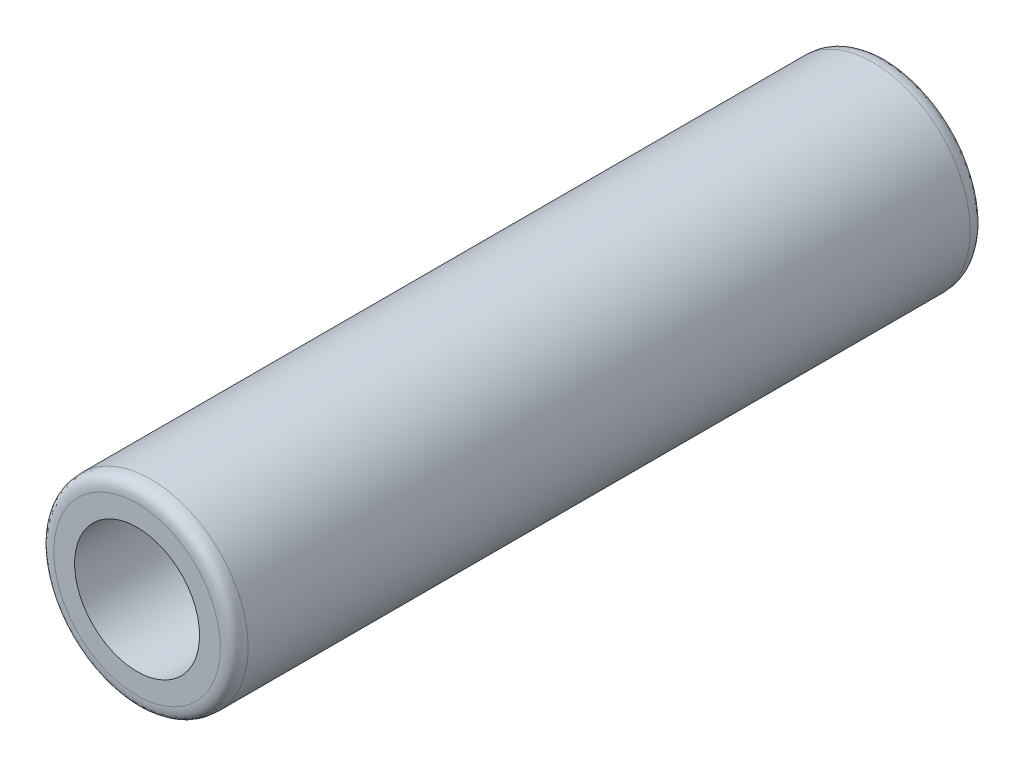
ISO-10303-21;
HEADER;
FILE_DESCRIPTION(('STEP AP214'),'2;1');
FILE_NAME('part.step','',(''),(''),'','','');
FILE_SCHEMA(('AUTOMOTIVE_DESIGN { 1 0 10303 214 1 1 1 1 }'));
ENDSEC;
DATA;
#1=APPLICATION_CONTEXT('core data for automotive mechanical design processes');
#2=APPLICATION_PROTOCOL_DEFINITION('international standard','automotive_design',2000,#1);
#3=PRODUCT_CONTEXT('',#1,'mechanical');
#4=PRODUCT('Part','Part','',(#3));
#5=PRODUCT_RELATED_PRODUCT_CATEGORY('part','',(#4));
#6=PRODUCT_DEFINITION_FORMATION('','',#4);
#7=PRODUCT_DEFINITION_CONTEXT('part definition',#1,'design');
#8=PRODUCT_DEFINITION('design','',#6,#7);
#9=PRODUCT_DEFINITION_SHAPE('','',#8);
#10=(LENGTH_UNIT() NAMED_UNIT(*) SI_UNIT(.MILLI.,.METRE.));
#11=(NAMED_UNIT(*) PLANE_ANGLE_UNIT() SI_UNIT($,.RADIAN.));
#12=(NAMED_UNIT(*) SI_UNIT($,.STERADIAN.) SOLID_ANGLE_UNIT());
#13=UNCERTAINTY_MEASURE_WITH_UNIT(LENGTH_MEASURE(1.E-05),#10,'distance_accuracy_value','');
#14=(GEOMETRIC_REPRESENTATION_CONTEXT(3) GLOBAL_UNCERTAINTY_ASSIGNED_CONTEXT((#13)) GLOBAL_UNIT_ASSIGNED_CONTEXT((#10,
#11,#12)) REPRESENTATION_CONTEXT('',''));
#15=CARTESIAN_POINT('',(0.,0.,0.));
#16=DIRECTION('',(0.,0.,1.));
#17=DIRECTION('',(1.,0.,0.));
#18=AXIS2_PLACEMENT_3D('',#15,#16,#17);
#19=CARTESIAN_POINT('',(0.,0.,13.5));
#20=DIRECTION('',(0.,0.,1.));
#21=DIRECTION('',(1.,0.,0.));
#22=AXIS2_PLACEMENT_3D('',#19,#20,#21);
#23=PLANE('',#22);
#24=CARTESIAN_POINT('',(3.,0.,13.5));
#25=CARTESIAN_POINT('',(3.,-0.783611624891226,13.5));
#26=CARTESIAN_POINT('',(2.35083487467366,-2.35083487467368,13.5));
#27=CARTESIAN_POINT('',(0.,-3.32458256266316,13.5));
#28=CARTESIAN_POINT('',(-2.35083487467368,-2.35083487467368,13.5));
#29=CARTESIAN_POINT('',(-3.32458256266316,0.,13.5));
#30=CARTESIAN_POINT('',(-2.35083487467368,2.35083487467367,13.5));
#31=CARTESIAN_POINT('',(0.,3.32458256266316,13.5));
#32=CARTESIAN_POINT('',(2.35083487467367,2.35083487467367,13.5));
#33=CARTESIAN_POINT('',(3.,0.783611624891226,13.5));
#34=CARTESIAN_POINT('',(3.,0.,13.5));
#35=B_SPLINE_CURVE_WITH_KNOTS('',3,(#24,#25,#26,#27,#28,#29,#30,#31,#32,#33,#34),.UNSPECIFIED.,
.T.,.F.,(4,1,1,1,1,1,1,1,4),(0.,0.785398163397448,1.5707963267949,2.35619449019235,
3.14159265358979,3.92699081698724,4.71238898038469,5.49778714378214,6.28318530717959),.UNSPECIFIED.);
#36=CARTESIAN_POINT('',(3.,0.,13.5));
#37=VERTEX_POINT('',#36);
#38=EDGE_CURVE('E10',#37,#37,#35,.F.);
#39=ORIENTED_EDGE('',*,*,#38,.T.);
#40=EDGE_LOOP('',(#39));
#41=FACE_BOUND('',#40,.T.);
#42=CARTESIAN_POINT('',(0.,0.,13.5));
#43=DIRECTION('',(0.,0.,1.));
#44=DIRECTION('',(1.,0.,0.));
#45=AXIS2_PLACEMENT_3D('',#42,#43,#44);
#46=CIRCLE('',#45,2.25);
#47=CARTESIAN_POINT('',(2.25,0.,13.5));
#48=VERTEX_POINT('',#47);
#49=EDGE_CURVE('E71',#48,#48,#46,.T.);
#50=ORIENTED_EDGE('',*,*,#49,.F.);
#51=EDGE_LOOP('',(#50));
#52=FACE_BOUND('',#51,.T.);
#53=ADVANCED_FACE('F39',(#41,#52),#23,.T.);
#54=CARTESIAN_POINT('',(0.,0.,-13.5));
#55=DIRECTION('',(0.,0.,1.));
#56=DIRECTION('',(1.,0.,0.));
#57=AXIS2_PLACEMENT_3D('',#54,#55,#56);
#58=PLANE('',#57);
#59=CARTESIAN_POINT('',(3.,0.,-13.5));
#60=CARTESIAN_POINT('',(3.,0.783611624891226,-13.5));
#61=CARTESIAN_POINT('',(2.35083487467367,2.35083487467367,-13.5));
#62=CARTESIAN_POINT('',(0.,3.32458256266316,-13.5));
#63=CARTESIAN_POINT('',(-2.35083487467368,2.35083487467367,-13.5));
#64=CARTESIAN_POINT('',(-3.32458256266316,0.,-13.5));
#65=CARTESIAN_POINT('',(-2.35083487467368,-2.35083487467368,-13.5));
#66=CARTESIAN_POINT('',(0.,-3.32458256266316,-13.5));
#67=CARTESIAN_POINT('',(2.35083487467366,-2.35083487467368,-13.5));
#68=CARTESIAN_POINT('',(3.,-0.783611624891226,-13.5));
#69=CARTESIAN_POINT('',(3.,0.,-13.5));
#70=B_SPLINE_CURVE_WITH_KNOTS('',3,(#59,#60,#61,#62,#63,#64,#65,#66,#67,#68,#69),.UNSPECIFIED.,
.T.,.F.,(4,1,1,1,1,1,1,1,4),(0.,0.785398163397448,1.5707963267949,2.35619449019234,
3.14159265358979,3.92699081698724,4.71238898038469,5.49778714378214,6.28318530717959),.UNSPECIFIED.);
#71=CARTESIAN_POINT('',(3.,0.,-13.5));
#72=VERTEX_POINT('',#71);
#73=EDGE_CURVE('E53',#72,#72,#70,.F.);
#74=ORIENTED_EDGE('',*,*,#73,.T.);
#75=EDGE_LOOP('',(#74));
#76=FACE_BOUND('',#75,.T.);
#77=CARTESIAN_POINT('',(0.,0.,-13.5));
#78=DIRECTION('',(0.,0.,1.));
#79=DIRECTION('',(1.,0.,0.));
#80=AXIS2_PLACEMENT_3D('',#77,#78,#79);
#81=CIRCLE('',#80,2.25);
#82=CARTESIAN_POINT('',(2.25,0.,-13.5));
#83=VERTEX_POINT('',#82);
#84=EDGE_CURVE('E77',#83,#83,#81,.T.);
#85=ORIENTED_EDGE('',*,*,#84,.T.);
#86=EDGE_LOOP('',(#85));
#87=FACE_BOUND('',#86,.T.);
#88=ADVANCED_FACE('F99',(#76,#87),#58,.F.);
#89=CARTESIAN_POINT('',(0.,0.,13.5));
#90=DIRECTION('',(0.,0.,-1.));
#91=DIRECTION('',(-1.,0.,0.));
#92=AXIS2_PLACEMENT_3D('',#89,#90,#91);
#93=CYLINDRICAL_SURFACE('',#92,3.5);
#94=CARTESIAN_POINT('',(3.5,0.,-13.));
#95=CARTESIAN_POINT('',(3.5,-0.914213562373097,-13.));
#96=CARTESIAN_POINT('',(2.74264068711927,-2.7426406871193,-13.));
#97=CARTESIAN_POINT('',(0.,-3.87867965644035,-13.));
#98=CARTESIAN_POINT('',(-2.74264068711929,-2.74264068711929,-13.));
#99=CARTESIAN_POINT('',(-3.87867965644036,0.,-13.));
#100=CARTESIAN_POINT('',(-2.74264068711929,2.74264068711928,-13.));
#101=CARTESIAN_POINT('',(0.,3.87867965644036,-13.));
#102=CARTESIAN_POINT('',(2.74264068711928,2.74264068711928,-13.));
#103=CARTESIAN_POINT('',(3.5,0.914213562373097,-13.));
#104=CARTESIAN_POINT('',(3.5,0.,-13.));
#105=B_SPLINE_CURVE_WITH_KNOTS('',3,(#94,#95,#96,#97,#98,#99,#100,#101,#102,#103,#104),
.UNSPECIFIED.,.T.,.F.,(4,1,1,1,1,1,1,1,4),(0.,0.785398163397448,1.5707963267949,
2.35619449019235,3.14159265358979,3.92699081698724,4.71238898038469,5.49778714378214,
6.28318530717959),.UNSPECIFIED.);
#106=CARTESIAN_POINT('',(3.5,0.,-13.));
#107=VERTEX_POINT('',#106);
#108=EDGE_CURVE('E59',#107,#107,#105,.F.);
#109=ORIENTED_EDGE('',*,*,#108,.T.);
#110=EDGE_LOOP('',(#109));
#111=FACE_BOUND('',#110,.T.);
#112=CARTESIAN_POINT('',(3.5,0.,13.));
#113=CARTESIAN_POINT('',(3.5,0.914213562373097,13.));
#114=CARTESIAN_POINT('',(2.74264068711928,2.74264068711928,13.));
#115=CARTESIAN_POINT('',(0.,3.87867965644036,13.));
#116=CARTESIAN_POINT('',(-2.74264068711929,2.74264068711928,13.));
#117=CARTESIAN_POINT('',(-3.87867965644036,0.,13.));
#118=CARTESIAN_POINT('',(-2.74264068711929,-2.74264068711929,13.));
#119=CARTESIAN_POINT('',(0.,-3.87867965644035,13.));
#120=CARTESIAN_POINT('',(2.74264068711927,-2.7426406871193,13.));
#121=CARTESIAN_POINT('',(3.5,-0.914213562373097,13.));
#122=CARTESIAN_POINT('',(3.5,0.,13.));
#123=B_SPLINE_CURVE_WITH_KNOTS('',3,(#112,#113,#114,#115,#116,#117,#118,#119,#120,#121,#122),
.UNSPECIFIED.,.T.,.F.,(4,1,1,1,1,1,1,1,4),(0.,0.785398163397448,1.5707963267949,
2.35619449019234,3.14159265358979,3.92699081698724,4.71238898038469,5.49778714378214,
6.28318530717959),.UNSPECIFIED.);
#124=CARTESIAN_POINT('',(3.5,0.,13.));
#125=VERTEX_POINT('',#124);
#126=EDGE_CURVE('E65',#125,#125,#123,.F.);
#127=ORIENTED_EDGE('',*,*,#126,.T.);
#128=EDGE_LOOP('',(#127));
#129=FACE_BOUND('',#128,.T.);
#130=ADVANCED_FACE('F89',(#111,#129),#93,.T.);
#131=CARTESIAN_POINT('',(0.,0.,13.5));
#132=DIRECTION('',(0.,0.,-1.));
#133=DIRECTION('',(-1.,0.,0.));
#134=AXIS2_PLACEMENT_3D('',#131,#132,#133);
#135=CYLINDRICAL_SURFACE('',#134,2.25);
#136=ORIENTED_EDGE('',*,*,#49,.T.);
#137=EDGE_LOOP('',(#136));
#138=FACE_BOUND('',#137,.T.);
#139=ORIENTED_EDGE('',*,*,#84,.F.);
#140=EDGE_LOOP('',(#139));
#141=FACE_BOUND('',#140,.T.);
#142=ADVANCED_FACE('F98',(#138,#141),#135,.F.);
#143=CARTESIAN_POINT('',(3.5,0.,-13.));
#144=CARTESIAN_POINT('',(3.5,0.914213562373097,-13.));
#145=CARTESIAN_POINT('',(2.74264068711928,2.74264068711928,-13.));
#146=CARTESIAN_POINT('',(0.,3.87867965644036,-13.));
#147=CARTESIAN_POINT('',(-2.74264068711929,2.74264068711928,-13.));
#148=CARTESIAN_POINT('',(-3.87867965644036,0.,-13.));
#149=CARTESIAN_POINT('',(-2.74264068711929,-2.74264068711929,-13.));
#150=CARTESIAN_POINT('',(0.,-3.87867965644035,-13.));
#151=CARTESIAN_POINT('',(2.74264068711927,-2.7426406871193,-13.));
#152=CARTESIAN_POINT('',(3.5,-0.914213562373097,-13.));
#153=CARTESIAN_POINT('',(3.5,0.,-13.));
#154=CARTESIAN_POINT('',(3.5,0.,-13.084099025767));
#155=CARTESIAN_POINT('',(3.5,0.914213562373097,-13.084099025767));
#156=CARTESIAN_POINT('',(2.74264068711928,2.74264068711928,-13.084099025767));
#157=CARTESIAN_POINT('',(0.,3.87867965644036,-13.084099025767));
#158=CARTESIAN_POINT('',(-2.74264068711929,2.74264068711928,-13.084099025767));
#159=CARTESIAN_POINT('',(-3.87867965644036,0.,-13.084099025767));
#160=CARTESIAN_POINT('',(-2.74264068711929,-2.74264068711929,-13.084099025767));
#161=CARTESIAN_POINT('',(0.,-3.87867965644035,-13.084099025767));
#162=CARTESIAN_POINT('',(2.74264068711927,-2.7426406871193,-13.084099025767));
#163=CARTESIAN_POINT('',(3.5,-0.914213562373097,-13.084099025767));
#164=CARTESIAN_POINT('',(3.5,0.,-13.084099025767));
#165=CARTESIAN_POINT('',(3.5,0.,-13.1681980515339));
#166=CARTESIAN_POINT('',(3.5,0.914213562373097,-13.1681980515339));
#167=CARTESIAN_POINT('',(2.74264068711928,2.74264068711928,-13.1681980515339));
#168=CARTESIAN_POINT('',(0.,3.87867965644036,-13.1681980515339));
#169=CARTESIAN_POINT('',(-2.74264068711929,2.74264068711928,-13.1681980515339));
#170=CARTESIAN_POINT('',(-3.87867965644036,0.,-13.1681980515339));
#171=CARTESIAN_POINT('',(-2.74264068711929,-2.74264068711929,-13.168198051534));
#172=CARTESIAN_POINT('',(0.,-3.87867965644035,-13.1681980515339));
#173=CARTESIAN_POINT('',(2.74264068711927,-2.7426406871193,-13.168198051534));
#174=CARTESIAN_POINT('',(3.5,-0.914213562373097,-13.1681980515339));
#175=CARTESIAN_POINT('',(3.5,0.,-13.1681980515339));
#176=CARTESIAN_POINT('',(3.46415404008196,0.,-13.3535533905933));
#177=CARTESIAN_POINT('',(3.46415404008196,0.904850458740709,-13.3535533905933));
#178=CARTESIAN_POINT('',(2.71455137622212,2.71455137622212,-13.3535533905933));
#179=CARTESIAN_POINT('',(0.,3.83895537201188,-13.3535533905933));
#180=CARTESIAN_POINT('',(-2.71455137622213,2.71455137622212,-13.3535533905933));
#181=CARTESIAN_POINT('',(-3.83895537201187,0.,-13.3535533905933));
#182=CARTESIAN_POINT('',(-2.71455137622212,-2.71455137622212,-13.3535533905933));
#183=CARTESIAN_POINT('',(0.,-3.83895537201187,-13.3535533905933));
#184=CARTESIAN_POINT('',(2.71455137622211,-2.71455137622214,-13.3535533905933));
#185=CARTESIAN_POINT('',(3.46415404008196,-0.904850458740709,-13.3535533905933));
#186=CARTESIAN_POINT('',(3.46415404008196,0.,-13.3535533905933));
#187=CARTESIAN_POINT('',(3.35355339059327,0.,-13.464154040082));
#188=CARTESIAN_POINT('',(3.35355339059328,0.875961140520759,-13.464154040082));
#189=CARTESIAN_POINT('',(2.62788342156227,2.62788342156227,-13.464154040082));
#190=CARTESIAN_POINT('',(0.,3.71638837510878,-13.464154040082));
#191=CARTESIAN_POINT('',(-2.62788342156227,2.62788342156227,-13.464154040082));
#192=CARTESIAN_POINT('',(-3.71638837510877,0.,-13.464154040082));
#193=CARTESIAN_POINT('',(-2.62788342156227,-2.62788342156227,-13.464154040082));
#194=CARTESIAN_POINT('',(0.,-3.71638837510877,-13.464154040082));
#195=CARTESIAN_POINT('',(2.62788342156226,-2.62788342156229,-13.464154040082));
#196=CARTESIAN_POINT('',(3.35355339059327,-0.875961140520759,-13.464154040082));
#197=CARTESIAN_POINT('',(3.35355339059327,0.,-13.464154040082));
#198=CARTESIAN_POINT('',(3.16819805153395,0.,-13.5));
#199=CARTESIAN_POINT('',(3.16819805153395,0.827545607713244,-13.5));
#200=CARTESIAN_POINT('',(2.48263682313973,2.48263682313973,-13.5));
#201=CARTESIAN_POINT('',(0.,3.51097866573106,-13.5));
#202=CARTESIAN_POINT('',(-2.48263682313973,2.48263682313972,-13.5));
#203=CARTESIAN_POINT('',(-3.51097866573106,0.,-13.5));
#204=CARTESIAN_POINT('',(-2.48263682313973,-2.48263682313973,-13.5));
#205=CARTESIAN_POINT('',(0.,-3.51097866573105,-13.5));
#206=CARTESIAN_POINT('',(2.48263682313971,-2.48263682313974,-13.5));
#207=CARTESIAN_POINT('',(3.16819805153394,-0.827545607713244,-13.5));
#208=CARTESIAN_POINT('',(3.16819805153395,0.,-13.5));
#209=CARTESIAN_POINT('',(3.08409902576697,0.,-13.5));
#210=CARTESIAN_POINT('',(3.08409902576698,0.805578616302235,-13.5));
#211=CARTESIAN_POINT('',(2.4167358489067,2.4167358489067,-13.5));
#212=CARTESIAN_POINT('',(0.,3.41778061419711,-13.5));
#213=CARTESIAN_POINT('',(-2.4167358489067,2.4167358489067,-13.5));
#214=CARTESIAN_POINT('',(-3.41778061419711,0.,-13.5));
#215=CARTESIAN_POINT('',(-2.4167358489067,-2.4167358489067,-13.5));
#216=CARTESIAN_POINT('',(0.,-3.41778061419711,-13.5));
#217=CARTESIAN_POINT('',(2.41673584890669,-2.41673584890671,-13.5));
#218=CARTESIAN_POINT('',(3.08409902576697,-0.805578616302235,-13.5));
#219=CARTESIAN_POINT('',(3.08409902576697,0.,-13.5));
#220=CARTESIAN_POINT('',(3.,0.,-13.5));
#221=CARTESIAN_POINT('',(3.,0.783611624891226,-13.5));
#222=CARTESIAN_POINT('',(2.35083487467367,2.35083487467367,-13.5));
#223=CARTESIAN_POINT('',(0.,3.32458256266316,-13.5));
#224=CARTESIAN_POINT('',(-2.35083487467368,2.35083487467367,-13.5));
#225=CARTESIAN_POINT('',(-3.32458256266316,0.,-13.5));
#226=CARTESIAN_POINT('',(-2.35083487467368,-2.35083487467368,-13.5));
#227=CARTESIAN_POINT('',(0.,-3.32458256266316,-13.5));
#228=CARTESIAN_POINT('',(2.35083487467366,-2.35083487467368,-13.5));
#229=CARTESIAN_POINT('',(3.,-0.783611624891226,-13.5));
#230=CARTESIAN_POINT('',(3.,0.,-13.5));
#231=B_SPLINE_SURFACE_WITH_KNOTS('',5,3,((#143,#144,#145,#146,#147,#148,#149,#150,#151,#152,
#153),(#154,#155,#156,#157,#158,#159,#160,#161,#162,#163,#164),(#165,#166,#167,#168,#169,#170,
#171,#172,#173,#174,#175),(#176,#177,#178,#179,#180,#181,#182,#183,#184,#185,#186),(#187,#188,
#189,#190,#191,#192,#193,#194,#195,#196,#197),(#198,#199,#200,#201,#202,#203,#204,#205,#206,
#207,#208),(#209,#210,#211,#212,#213,#214,#215,#216,#217,#218,#219),(#220,#221,#222,#223,#224,
#225,#226,#227,#228,#229,#230)),.UNSPECIFIED.,.F.,.T.,.F.,(6,2,6),(4,1,1,1,1,1,1,1,4),(0.,0.5,
1.),(0.,0.785398163397448,1.5707963267949,2.35619449019234,3.14159265358979,3.92699081698724,
4.71238898038469,5.49778714378214,6.28318530717959),.UNSPECIFIED.);
#232=ORIENTED_EDGE('',*,*,#73,.F.);
#233=EDGE_LOOP('',(#232));
#234=FACE_BOUND('',#233,.T.);
#235=ORIENTED_EDGE('',*,*,#108,.F.);
#236=EDGE_LOOP('',(#235));
#237=FACE_BOUND('',#236,.T.);
#238=ADVANCED_FACE('F103',(#234,#237),#231,.T.);
#239=CARTESIAN_POINT('',(3.,0.,13.5));
#240=CARTESIAN_POINT('',(3.,0.783611624891226,13.5));
#241=CARTESIAN_POINT('',(2.35083487467367,2.35083487467367,13.5));
#242=CARTESIAN_POINT('',(0.,3.32458256266316,13.5));
#243=CARTESIAN_POINT('',(-2.35083487467368,2.35083487467367,13.5));
#244=CARTESIAN_POINT('',(-3.32458256266316,0.,13.5));
#245=CARTESIAN_POINT('',(-2.35083487467368,-2.35083487467368,13.5));
#246=CARTESIAN_POINT('',(0.,-3.32458256266316,13.5));
#247=CARTESIAN_POINT('',(2.35083487467366,-2.35083487467368,13.5));
#248=CARTESIAN_POINT('',(3.,-0.783611624891226,13.5));
#249=CARTESIAN_POINT('',(3.,0.,13.5));
#250=CARTESIAN_POINT('',(3.08409902576697,0.,13.5));
#251=CARTESIAN_POINT('',(3.08409902576698,0.805578616302235,13.5));
#252=CARTESIAN_POINT('',(2.4167358489067,2.4167358489067,13.5));
#253=CARTESIAN_POINT('',(0.,3.41778061419711,13.5));
#254=CARTESIAN_POINT('',(-2.4167358489067,2.4167358489067,13.5));
#255=CARTESIAN_POINT('',(-3.41778061419711,0.,13.5));
#256=CARTESIAN_POINT('',(-2.4167358489067,-2.4167358489067,13.5));
#257=CARTESIAN_POINT('',(0.,-3.41778061419711,13.5));
#258=CARTESIAN_POINT('',(2.41673584890669,-2.41673584890671,13.5));
#259=CARTESIAN_POINT('',(3.08409902576697,-0.805578616302235,13.5));
#260=CARTESIAN_POINT('',(3.08409902576697,0.,13.5));
#261=CARTESIAN_POINT('',(3.16819805153395,0.,13.5));
#262=CARTESIAN_POINT('',(3.16819805153395,0.827545607713244,13.5));
#263=CARTESIAN_POINT('',(2.48263682313973,2.48263682313973,13.5));
#264=CARTESIAN_POINT('',(0.,3.51097866573106,13.5));
#265=CARTESIAN_POINT('',(-2.48263682313973,2.48263682313972,13.5));
#266=CARTESIAN_POINT('',(-3.51097866573106,0.,13.5));
#267=CARTESIAN_POINT('',(-2.48263682313973,-2.48263682313973,13.5));
#268=CARTESIAN_POINT('',(0.,-3.51097866573105,13.5));
#269=CARTESIAN_POINT('',(2.48263682313971,-2.48263682313974,13.5));
#270=CARTESIAN_POINT('',(3.16819805153394,-0.827545607713244,13.5));
#271=CARTESIAN_POINT('',(3.16819805153395,0.,13.5));
#272=CARTESIAN_POINT('',(3.35355339059327,0.,13.464154040082));
#273=CARTESIAN_POINT('',(3.35355339059328,0.875961140520759,13.464154040082));
#274=CARTESIAN_POINT('',(2.62788342156227,2.62788342156227,13.464154040082));
#275=CARTESIAN_POINT('',(0.,3.71638837510878,13.464154040082));
#276=CARTESIAN_POINT('',(-2.62788342156227,2.62788342156227,13.464154040082));
#277=CARTESIAN_POINT('',(-3.71638837510877,0.,13.464154040082));
#278=CARTESIAN_POINT('',(-2.62788342156227,-2.62788342156227,13.464154040082));
#279=CARTESIAN_POINT('',(0.,-3.71638837510877,13.464154040082));
#280=CARTESIAN_POINT('',(2.62788342156226,-2.62788342156229,13.464154040082));
#281=CARTESIAN_POINT('',(3.35355339059327,-0.875961140520759,13.464154040082));
#282=CARTESIAN_POINT('',(3.35355339059327,0.,13.464154040082));
#283=CARTESIAN_POINT('',(3.46415404008196,0.,13.3535533905933));
#284=CARTESIAN_POINT('',(3.46415404008196,0.904850458740709,13.3535533905933));
#285=CARTESIAN_POINT('',(2.71455137622212,2.71455137622212,13.3535533905933));
#286=CARTESIAN_POINT('',(0.,3.83895537201188,13.3535533905933));
#287=CARTESIAN_POINT('',(-2.71455137622213,2.71455137622212,13.3535533905933));
#288=CARTESIAN_POINT('',(-3.83895537201187,0.,13.3535533905933));
#289=CARTESIAN_POINT('',(-2.71455137622212,-2.71455137622212,13.3535533905933));
#290=CARTESIAN_POINT('',(0.,-3.83895537201187,13.3535533905933));
#291=CARTESIAN_POINT('',(2.71455137622211,-2.71455137622214,13.3535533905933));
#292=CARTESIAN_POINT('',(3.46415404008196,-0.904850458740709,13.3535533905933));
#293=CARTESIAN_POINT('',(3.46415404008196,0.,13.3535533905933));
#294=CARTESIAN_POINT('',(3.5,0.,13.1681980515339));
#295=CARTESIAN_POINT('',(3.5,0.914213562373097,13.1681980515339));
#296=CARTESIAN_POINT('',(2.74264068711928,2.74264068711928,13.1681980515339));
#297=CARTESIAN_POINT('',(0.,3.87867965644036,13.1681980515339));
#298=CARTESIAN_POINT('',(-2.74264068711929,2.74264068711928,13.1681980515339));
#299=CARTESIAN_POINT('',(-3.87867965644036,0.,13.1681980515339));
#300=CARTESIAN_POINT('',(-2.74264068711929,-2.74264068711929,13.168198051534));
#301=CARTESIAN_POINT('',(0.,-3.87867965644035,13.1681980515339));
#302=CARTESIAN_POINT('',(2.74264068711927,-2.7426406871193,13.168198051534));
#303=CARTESIAN_POINT('',(3.5,-0.914213562373097,13.1681980515339));
#304=CARTESIAN_POINT('',(3.5,0.,13.1681980515339));
#305=CARTESIAN_POINT('',(3.5,0.,13.084099025767));
#306=CARTESIAN_POINT('',(3.5,0.914213562373097,13.084099025767));
#307=CARTESIAN_POINT('',(2.74264068711928,2.74264068711928,13.084099025767));
#308=CARTESIAN_POINT('',(0.,3.87867965644036,13.084099025767));
#309=CARTESIAN_POINT('',(-2.74264068711929,2.74264068711928,13.084099025767));
#310=CARTESIAN_POINT('',(-3.87867965644036,0.,13.084099025767));
#311=CARTESIAN_POINT('',(-2.74264068711929,-2.74264068711929,13.084099025767));
#312=CARTESIAN_POINT('',(0.,-3.87867965644035,13.084099025767));
#313=CARTESIAN_POINT('',(2.74264068711927,-2.7426406871193,13.084099025767));
#314=CARTESIAN_POINT('',(3.5,-0.914213562373097,13.084099025767));
#315=CARTESIAN_POINT('',(3.5,0.,13.084099025767));
#316=CARTESIAN_POINT('',(3.5,0.,13.));
#317=CARTESIAN_POINT('',(3.5,0.914213562373097,13.));
#318=CARTESIAN_POINT('',(2.74264068711928,2.74264068711928,13.));
#319=CARTESIAN_POINT('',(0.,3.87867965644036,13.));
#320=CARTESIAN_POINT('',(-2.74264068711929,2.74264068711928,13.));
#321=CARTESIAN_POINT('',(-3.87867965644036,0.,13.));
#322=CARTESIAN_POINT('',(-2.74264068711929,-2.74264068711929,13.));
#323=CARTESIAN_POINT('',(0.,-3.87867965644035,13.));
#324=CARTESIAN_POINT('',(2.74264068711927,-2.7426406871193,13.));
#325=CARTESIAN_POINT('',(3.5,-0.914213562373097,13.));
#326=CARTESIAN_POINT('',(3.5,0.,13.));
#327=B_SPLINE_SURFACE_WITH_KNOTS('',5,3,((#239,#240,#241,#242,#243,#244,#245,#246,#247,#248,
#249),(#250,#251,#252,#253,#254,#255,#256,#257,#258,#259,#260),(#261,#262,#263,#264,#265,#266,
#267,#268,#269,#270,#271),(#272,#273,#274,#275,#276,#277,#278,#279,#280,#281,#282),(#283,#284,
#285,#286,#287,#288,#289,#290,#291,#292,#293),(#294,#295,#296,#297,#298,#299,#300,#301,#302,
#303,#304),(#305,#306,#307,#308,#309,#310,#311,#312,#313,#314,#315),(#316,#317,#318,#319,#320,
#321,#322,#323,#324,#325,#326)),.UNSPECIFIED.,.F.,.T.,.F.,(6,2,6),(4,1,1,1,1,1,1,1,4),(0.,0.5,
1.),(0.,0.785398163397448,1.5707963267949,2.35619449019234,3.14159265358979,3.92699081698724,
4.71238898038469,5.49778714378214,6.28318530717959),.UNSPECIFIED.);
#328=ORIENTED_EDGE('',*,*,#126,.F.);
#329=EDGE_LOOP('',(#328));
#330=FACE_BOUND('',#329,.T.);
#331=ORIENTED_EDGE('',*,*,#38,.F.);
#332=EDGE_LOOP('',(#331));
#333=FACE_BOUND('',#332,.T.);
#334=ADVANCED_FACE('F42',(#330,#333),#327,.T.);
#335=CLOSED_SHELL('',(#53,#88,#130,#142,#238,#334));
#336=MANIFOLD_SOLID_BREP('B2',#335);
#337=ADVANCED_BREP_SHAPE_REPRESENTATION('',(#18,#336),#14);
#338=SHAPE_DEFINITION_REPRESENTATION(#9,#337);
ENDSEC;
END-ISO-10303-21;
